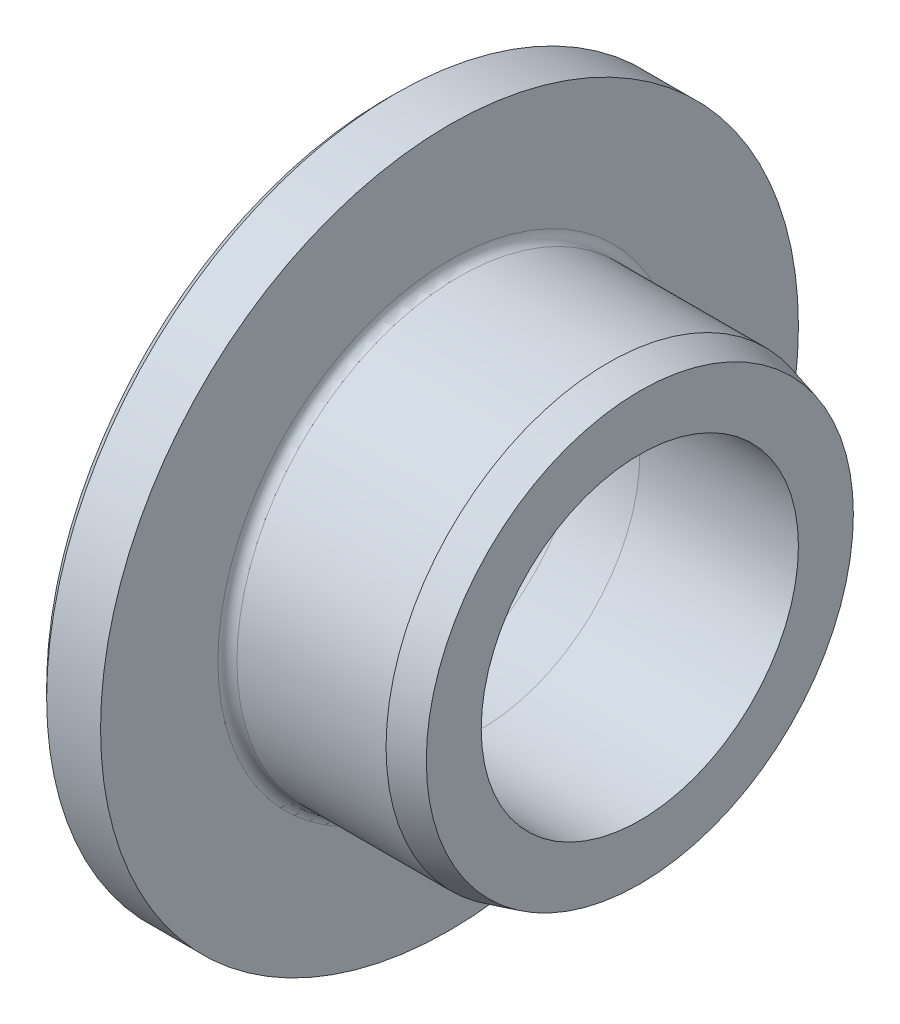
ISO-10303-21;
HEADER;
FILE_DESCRIPTION(('STEP AP214'),'2;1');
FILE_NAME('part.step','',(''),(''),'','','');
FILE_SCHEMA(('AUTOMOTIVE_DESIGN { 1 0 10303 214 1 1 1 1 }'));
ENDSEC;
DATA;
#1=APPLICATION_CONTEXT('core data for automotive mechanical design processes');
#2=APPLICATION_PROTOCOL_DEFINITION('international standard','automotive_design',2000,#1);
#3=PRODUCT_CONTEXT('',#1,'mechanical');
#4=PRODUCT('Part','Part','',(#3));
#5=PRODUCT_RELATED_PRODUCT_CATEGORY('part','',(#4));
#6=PRODUCT_DEFINITION_FORMATION('','',#4);
#7=PRODUCT_DEFINITION_CONTEXT('part definition',#1,'design');
#8=PRODUCT_DEFINITION('design','',#6,#7);
#9=PRODUCT_DEFINITION_SHAPE('','',#8);
#10=(LENGTH_UNIT() NAMED_UNIT(*) SI_UNIT(.MILLI.,.METRE.));
#11=(NAMED_UNIT(*) PLANE_ANGLE_UNIT() SI_UNIT($,.RADIAN.));
#12=(NAMED_UNIT(*) SI_UNIT($,.STERADIAN.) SOLID_ANGLE_UNIT());
#13=UNCERTAINTY_MEASURE_WITH_UNIT(LENGTH_MEASURE(1.E-05),#10,'distance_accuracy_value','');
#14=(GEOMETRIC_REPRESENTATION_CONTEXT(3) GLOBAL_UNCERTAINTY_ASSIGNED_CONTEXT((#13)) GLOBAL_UNIT_ASSIGNED_CONTEXT((#10,
#11,#12)) REPRESENTATION_CONTEXT('',''));
#15=CARTESIAN_POINT('',(0.,0.,0.));
#16=DIRECTION('',(0.,0.,1.));
#17=DIRECTION('',(1.,0.,0.));
#18=AXIS2_PLACEMENT_3D('',#15,#16,#17);
#19=CARTESIAN_POINT('',(-2.,11.,0.));
#20=DIRECTION('',(1.,0.,0.));
#21=DIRECTION('',(0.,0.,-1.));
#22=AXIS2_PLACEMENT_3D('',#19,#20,#21);
#23=PLANE('',#22);
#24=CARTESIAN_POINT('',(-2.,0.,0.));
#25=DIRECTION('',(1.,0.,0.));
#26=DIRECTION('',(0.,0.,-1.));
#27=AXIS2_PLACEMENT_3D('',#24,#25,#26);
#28=CIRCLE('',#27,6.36808057330269);
#29=CARTESIAN_POINT('',(-2.,0.,-6.36808057330269));
#30=VERTEX_POINT('',#29);
#31=EDGE_CURVE('E48',#30,#30,#28,.T.);
#32=ORIENTED_EDGE('',*,*,#31,.T.);
#33=EDGE_LOOP('',(#32));
#34=FACE_BOUND('',#33,.T.);
#35=CARTESIAN_POINT('',(-2.,0.,0.));
#36=DIRECTION('',(1.,0.,0.));
#37=DIRECTION('',(0.,0.,-1.));
#38=AXIS2_PLACEMENT_3D('',#35,#36,#37);
#39=CIRCLE('',#38,10.7);
#40=CARTESIAN_POINT('',(-2.,0.,-10.7));
#41=VERTEX_POINT('',#40);
#42=EDGE_CURVE('E82',#41,#41,#39,.F.);
#43=ORIENTED_EDGE('',*,*,#42,.T.);
#44=EDGE_LOOP('',(#43));
#45=FACE_BOUND('',#44,.T.);
#46=ADVANCED_FACE('F40',(#34,#45),#23,.F.);
#47=CARTESIAN_POINT('',(-2.,0.,0.));
#48=DIRECTION('',(-1.,0.,0.));
#49=DIRECTION('',(0.,0.,1.));
#50=AXIS2_PLACEMENT_3D('',#47,#48,#49);
#51=CYLINDRICAL_SURFACE('',#50,5.);
#52=CARTESIAN_POINT('',(1.00000000000011,0.,0.));
#53=DIRECTION('',(1.,0.,0.));
#54=DIRECTION('',(0.,0.,-1.));
#55=AXIS2_PLACEMENT_3D('',#52,#53,#54);
#56=CIRCLE('',#55,5.);
#57=CARTESIAN_POINT('',(1.00000000000011,0.,-5.));
#58=VERTEX_POINT('',#57);
#59=EDGE_CURVE('E66',#58,#58,#56,.F.);
#60=ORIENTED_EDGE('',*,*,#59,.T.);
#61=EDGE_LOOP('',(#60));
#62=FACE_BOUND('',#61,.T.);
#63=CARTESIAN_POINT('',(6.,0.,0.));
#64=DIRECTION('',(-1.,0.,0.));
#65=DIRECTION('',(0.,0.,1.));
#66=AXIS2_PLACEMENT_3D('',#63,#64,#65);
#67=CIRCLE('',#66,5.);
#68=CARTESIAN_POINT('',(6.,0.,5.));
#69=VERTEX_POINT('',#68);
#70=EDGE_CURVE('E86',#69,#69,#67,.T.);
#71=ORIENTED_EDGE('',*,*,#70,.F.);
#72=EDGE_LOOP('',(#71));
#73=FACE_BOUND('',#72,.T.);
#74=ADVANCED_FACE('F114',(#62,#73),#51,.F.);
#75=CARTESIAN_POINT('',(6.,5.,0.));
#76=DIRECTION('',(-1.,0.,0.));
#77=DIRECTION('',(0.,0.,1.));
#78=AXIS2_PLACEMENT_3D('',#75,#76,#77);
#79=PLANE('',#78);
#80=CARTESIAN_POINT('',(6.,0.,0.));
#81=DIRECTION('',(-1.,0.,0.));
#82=DIRECTION('',(0.,0.,1.));
#83=AXIS2_PLACEMENT_3D('',#80,#81,#82);
#84=CIRCLE('',#83,6.73205080756888);
#85=CARTESIAN_POINT('',(6.,0.,6.73205080756888));
#86=VERTEX_POINT('',#85);
#87=EDGE_CURVE('E54',#86,#86,#84,.F.);
#88=ORIENTED_EDGE('',*,*,#87,.T.);
#89=EDGE_LOOP('',(#88));
#90=FACE_BOUND('',#89,.T.);
#91=ORIENTED_EDGE('',*,*,#70,.T.);
#92=EDGE_LOOP('',(#91));
#93=FACE_BOUND('',#92,.T.);
#94=ADVANCED_FACE('F110',(#90,#93),#79,.F.);
#95=CARTESIAN_POINT('',(-2.,0.,0.));
#96=DIRECTION('',(-1.,0.,0.));
#97=DIRECTION('',(0.,0.,1.));
#98=AXIS2_PLACEMENT_3D('',#95,#96,#97);
#99=CYLINDRICAL_SURFACE('',#98,7.);
#100=CARTESIAN_POINT('',(4.99999999999999,0.,0.));
#101=DIRECTION('',(-1.,0.,0.));
#102=DIRECTION('',(0.,0.,1.));
#103=AXIS2_PLACEMENT_3D('',#100,#101,#102);
#104=CIRCLE('',#103,7.);
#105=CARTESIAN_POINT('',(4.99999999999999,0.,7.));
#106=VERTEX_POINT('',#105);
#107=EDGE_CURVE('E60',#106,#106,#104,.T.);
#108=ORIENTED_EDGE('',*,*,#107,.T.);
#109=EDGE_LOOP('',(#108));
#110=FACE_BOUND('',#109,.T.);
#111=CARTESIAN_POINT('',(0.3,0.,0.));
#112=DIRECTION('',(-1.,0.,0.));
#113=DIRECTION('',(0.,0.,1.));
#114=AXIS2_PLACEMENT_3D('',#111,#112,#113);
#115=CIRCLE('',#114,7.);
#116=CARTESIAN_POINT('',(0.3,0.,7.));
#117=VERTEX_POINT('',#116);
#118=EDGE_CURVE('E70',#117,#117,#115,.F.);
#119=ORIENTED_EDGE('',*,*,#118,.T.);
#120=EDGE_LOOP('',(#119));
#121=FACE_BOUND('',#120,.T.);
#122=ADVANCED_FACE('F100',(#110,#121),#99,.T.);
#123=CARTESIAN_POINT('',(0.,7.,0.));
#124=DIRECTION('',(-1.,0.,0.));
#125=DIRECTION('',(0.,0.,1.));
#126=AXIS2_PLACEMENT_3D('',#123,#124,#125);
#127=PLANE('',#126);
#128=CARTESIAN_POINT('',(0.,0.,0.));
#129=DIRECTION('',(-1.,0.,0.));
#130=DIRECTION('',(0.,0.,1.));
#131=AXIS2_PLACEMENT_3D('',#128,#129,#130);
#132=CIRCLE('',#131,7.3);
#133=CARTESIAN_POINT('',(0.,0.,7.3));
#134=VERTEX_POINT('',#133);
#135=EDGE_CURVE('E74',#134,#134,#132,.T.);
#136=ORIENTED_EDGE('',*,*,#135,.T.);
#137=EDGE_LOOP('',(#136));
#138=FACE_BOUND('',#137,.T.);
#139=CARTESIAN_POINT('',(0.,0.,0.));
#140=DIRECTION('',(-1.,0.,0.));
#141=DIRECTION('',(0.,0.,1.));
#142=AXIS2_PLACEMENT_3D('',#139,#140,#141);
#143=CIRCLE('',#142,11.);
#144=CARTESIAN_POINT('',(0.,0.,11.));
#145=VERTEX_POINT('',#144);
#146=EDGE_CURVE('E90',#145,#145,#143,.T.);
#147=ORIENTED_EDGE('',*,*,#146,.F.);
#148=EDGE_LOOP('',(#147));
#149=FACE_BOUND('',#148,.T.);
#150=ADVANCED_FACE('F98',(#138,#149),#127,.F.);
#151=CARTESIAN_POINT('',(-2.,0.,0.));
#152=DIRECTION('',(-1.,0.,0.));
#153=DIRECTION('',(0.,0.,1.));
#154=AXIS2_PLACEMENT_3D('',#151,#152,#153);
#155=CYLINDRICAL_SURFACE('',#154,11.);
#156=CARTESIAN_POINT('',(-1.7,0.,0.));
#157=DIRECTION('',(1.,0.,0.));
#158=DIRECTION('',(0.,0.,-1.));
#159=AXIS2_PLACEMENT_3D('',#156,#157,#158);
#160=CIRCLE('',#159,11.);
#161=CARTESIAN_POINT('',(-1.7,0.,-11.));
#162=VERTEX_POINT('',#161);
#163=EDGE_CURVE('E78',#162,#162,#160,.T.);
#164=ORIENTED_EDGE('',*,*,#163,.T.);
#165=EDGE_LOOP('',(#164));
#166=FACE_BOUND('',#165,.T.);
#167=ORIENTED_EDGE('',*,*,#146,.T.);
#168=EDGE_LOOP('',(#167));
#169=FACE_BOUND('',#168,.T.);
#170=ADVANCED_FACE('F96',(#166,#169),#155,.T.);
#171=CARTESIAN_POINT('',(-2.,0.,0.));
#172=DIRECTION('',(1.,0.,0.));
#173=DIRECTION('',(0.,0.,-1.));
#174=AXIS2_PLACEMENT_3D('',#171,#172,#173);
#175=CONICAL_SURFACE('',#174,10.7,0.785398163397443);
#176=ORIENTED_EDGE('',*,*,#163,.F.);
#177=EDGE_LOOP('',(#176));
#178=FACE_BOUND('',#177,.T.);
#179=ORIENTED_EDGE('',*,*,#42,.F.);
#180=EDGE_LOOP('',(#179));
#181=FACE_BOUND('',#180,.T.);
#182=ADVANCED_FACE('F107',(#178,#181),#175,.T.);
#183=CARTESIAN_POINT('',(0.3,0.,0.));
#184=DIRECTION('',(-1.,0.,0.));
#185=DIRECTION('',(0.,0.,1.));
#186=AXIS2_PLACEMENT_3D('',#183,#184,#185);
#187=TOROIDAL_SURFACE('',#186,7.3,0.3);
#188=ORIENTED_EDGE('',*,*,#118,.F.);
#189=EDGE_LOOP('',(#188));
#190=FACE_BOUND('',#189,.T.);
#191=ORIENTED_EDGE('',*,*,#135,.F.);
#192=EDGE_LOOP('',(#191));
#193=FACE_BOUND('',#192,.T.);
#194=ADVANCED_FACE('F126',(#190,#193),#187,.F.);
#195=CARTESIAN_POINT('',(1.00000000000011,0.,0.));
#196=DIRECTION('',(-1.,0.,0.));
#197=DIRECTION('',(0.,0.,1.));
#198=AXIS2_PLACEMENT_3D('',#195,#196,#197);
#199=CONICAL_SURFACE('',#198,5.,0.17453292519943);
#200=CARTESIAN_POINT('',(-1.17364817766693,0.,0.));
#201=DIRECTION('',(-1.,0.,0.));
#202=DIRECTION('',(0.,0.,1.));
#203=AXIS2_PLACEMENT_3D('',#200,#201,#202);
#204=CIRCLE('',#203,5.38327282029048);
#205=CARTESIAN_POINT('',(-1.17364817766693,0.,5.38327282029048));
#206=VERTEX_POINT('',#205);
#207=EDGE_CURVE('E10',#206,#206,#204,.T.);
#208=ORIENTED_EDGE('',*,*,#207,.T.);
#209=EDGE_LOOP('',(#208));
#210=FACE_BOUND('',#209,.T.);
#211=ORIENTED_EDGE('',*,*,#59,.F.);
#212=EDGE_LOOP('',(#211));
#213=FACE_BOUND('',#212,.T.);
#214=ADVANCED_FACE('F130',(#210,#213),#199,.F.);
#215=CARTESIAN_POINT('',(4.99999999999999,0.,0.));
#216=DIRECTION('',(-1.,0.,0.));
#217=DIRECTION('',(0.,0.,1.));
#218=AXIS2_PLACEMENT_3D('',#215,#216,#217);
#219=CONICAL_SURFACE('',#218,7.,0.261799387799146);
#220=ORIENTED_EDGE('',*,*,#87,.F.);
#221=EDGE_LOOP('',(#220));
#222=FACE_BOUND('',#221,.T.);
#223=ORIENTED_EDGE('',*,*,#107,.F.);
#224=EDGE_LOOP('',(#223));
#225=FACE_BOUND('',#224,.T.);
#226=ADVANCED_FACE('F133',(#222,#225),#219,.T.);
#227=CARTESIAN_POINT('',(-0.999999999999999,0.,0.));
#228=DIRECTION('',(1.,0.,0.));
#229=DIRECTION('',(0.,0.,-1.));
#230=AXIS2_PLACEMENT_3D('',#227,#228,#229);
#231=TOROIDAL_SURFACE('',#230,6.36808057330269,1.);
#232=ORIENTED_EDGE('',*,*,#207,.F.);
#233=EDGE_LOOP('',(#232));
#234=FACE_BOUND('',#233,.T.);
#235=ORIENTED_EDGE('',*,*,#31,.F.);
#236=EDGE_LOOP('',(#235));
#237=FACE_BOUND('',#236,.T.);
#238=ADVANCED_FACE('F42',(#234,#237),#231,.T.);
#239=CLOSED_SHELL('',(#46,#74,#94,#122,#150,#170,#182,#194,#214,#226,#238));
#240=MANIFOLD_SOLID_BREP('B2',#239);
#241=ADVANCED_BREP_SHAPE_REPRESENTATION('',(#18,#240),#14);
#242=SHAPE_DEFINITION_REPRESENTATION(#9,#241);
ENDSEC;
END-ISO-10303-21;
